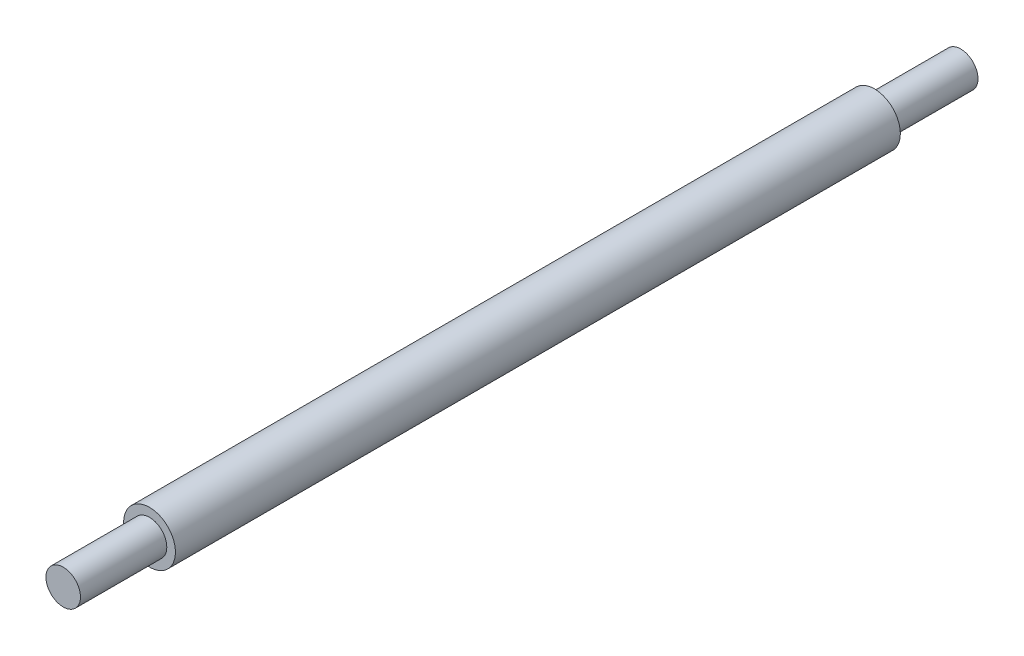
ISO-10303-21;
HEADER;
FILE_DESCRIPTION(('STEP AP214'),'2;1');
FILE_NAME('part.step','',(''),(''),'','','');
FILE_SCHEMA(('AUTOMOTIVE_DESIGN { 1 0 10303 214 1 1 1 1 }'));
ENDSEC;
DATA;
#1=APPLICATION_CONTEXT('core data for automotive mechanical design processes');
#2=APPLICATION_PROTOCOL_DEFINITION('international standard','automotive_design',2000,#1);
#3=PRODUCT_CONTEXT('',#1,'mechanical');
#4=PRODUCT('Part','Part','',(#3));
#5=PRODUCT_RELATED_PRODUCT_CATEGORY('part','',(#4));
#6=PRODUCT_DEFINITION_FORMATION('','',#4);
#7=PRODUCT_DEFINITION_CONTEXT('part definition',#1,'design');
#8=PRODUCT_DEFINITION('design','',#6,#7);
#9=PRODUCT_DEFINITION_SHAPE('','',#8);
#10=(LENGTH_UNIT() NAMED_UNIT(*) SI_UNIT(.MILLI.,.METRE.));
#11=(NAMED_UNIT(*) PLANE_ANGLE_UNIT() SI_UNIT($,.RADIAN.));
#12=(NAMED_UNIT(*) SI_UNIT($,.STERADIAN.) SOLID_ANGLE_UNIT());
#13=UNCERTAINTY_MEASURE_WITH_UNIT(LENGTH_MEASURE(1.E-05),#10,'distance_accuracy_value','');
#14=(GEOMETRIC_REPRESENTATION_CONTEXT(3) GLOBAL_UNCERTAINTY_ASSIGNED_CONTEXT((#13)) GLOBAL_UNIT_ASSIGNED_CONTEXT((#10,
#11,#12)) REPRESENTATION_CONTEXT('',''));
#15=CARTESIAN_POINT('',(0.,0.,0.));
#16=DIRECTION('',(0.,0.,1.));
#17=DIRECTION('',(1.,0.,0.));
#18=AXIS2_PLACEMENT_3D('',#15,#16,#17);
#19=CARTESIAN_POINT('',(-1.66533453693773E-13,2.22044604925031E-13,68.117647058823));
#20=DIRECTION('',(0.,0.,1.));
#21=DIRECTION('',(0.999999999999999,0.,0.));
#22=AXIS2_PLACEMENT_3D('',#19,#20,#21);
#23=CYLINDRICAL_SURFACE('',#22,2.);
#24=CARTESIAN_POINT('',(-3.33066907387547E-13,6.66133814775094E-13,51.9999999999996));
#25=DIRECTION('',(0.,0.,1.));
#26=DIRECTION('',(0.999999999999999,0.,0.));
#27=AXIS2_PLACEMENT_3D('',#24,#25,#26);
#28=CIRCLE('',#27,2.);
#29=CARTESIAN_POINT('',(1.99999999999966,6.64746035994312E-13,51.9999999999996));
#30=VERTEX_POINT('',#29);
#31=EDGE_CURVE('E10',#30,#30,#28,.T.);
#32=ORIENTED_EDGE('',*,*,#31,.F.);
#33=EDGE_LOOP('',(#32));
#34=FACE_BOUND('',#33,.T.);
#35=CARTESIAN_POINT('',(-2.77555756156289E-13,4.44089209850063E-13,41.9999999999994));
#36=DIRECTION('',(0.,0.,1.));
#37=DIRECTION('',(0.999999999999999,0.,0.));
#38=AXIS2_PLACEMENT_3D('',#35,#36,#37);
#39=CIRCLE('',#38,2.);
#40=CARTESIAN_POINT('',(1.99999999999972,4.42701431069281E-13,41.9999999999994));
#41=VERTEX_POINT('',#40);
#42=EDGE_CURVE('E67',#41,#41,#39,.T.);
#43=ORIENTED_EDGE('',*,*,#42,.T.);
#44=EDGE_LOOP('',(#43));
#45=FACE_BOUND('',#44,.T.);
#46=ADVANCED_FACE('F40',(#34,#45),#23,.T.);
#47=CARTESIAN_POINT('',(-1.11022302462516E-13,2.00000000000022,51.9999999999998));
#48=DIRECTION('',(0.,0.,-1.));
#49=DIRECTION('',(-0.999999999999999,0.,0.));
#50=AXIS2_PLACEMENT_3D('',#47,#48,#49);
#51=PLANE('',#50);
#52=ORIENTED_EDGE('',*,*,#31,.T.);
#53=EDGE_LOOP('',(#52));
#54=FACE_BOUND('',#53,.T.);
#55=ADVANCED_FACE('F98',(#54),#51,.F.);
#56=CARTESIAN_POINT('',(-3.33066907387547E-13,2.00000000000022,-52.0000000000005));
#57=DIRECTION('',(0.,0.,1.));
#58=DIRECTION('',(0.999999999999999,0.,0.));
#59=AXIS2_PLACEMENT_3D('',#56,#57,#58);
#60=PLANE('',#59);
#61=CARTESIAN_POINT('',(-4.9960036108132E-13,1.33226762955019E-12,-51.9999999999998));
#62=DIRECTION('',(0.,0.,1.));
#63=DIRECTION('',(0.999999999999999,0.,0.));
#64=AXIS2_PLACEMENT_3D('',#61,#62,#63);
#65=CIRCLE('',#64,2.00000000000001);
#66=CARTESIAN_POINT('',(1.99999999999951,1.33087985076941E-12,-51.9999999999998));
#67=VERTEX_POINT('',#66);
#68=EDGE_CURVE('E42',#67,#67,#65,.T.);
#69=ORIENTED_EDGE('',*,*,#68,.F.);
#70=EDGE_LOOP('',(#69));
#71=FACE_BOUND('',#70,.T.);
#72=ADVANCED_FACE('F93',(#71),#60,.F.);
#73=CARTESIAN_POINT('',(-1.66533453693773E-13,2.22044604925031E-13,68.117647058823));
#74=DIRECTION('',(0.,0.,1.));
#75=DIRECTION('',(0.999999999999999,0.,0.));
#76=AXIS2_PLACEMENT_3D('',#73,#74,#75);
#77=CYLINDRICAL_SURFACE('',#76,2.00000000000001);
#78=CARTESIAN_POINT('',(-6.10622663543836E-13,1.33226762955019E-12,-41.9999999999996));
#79=DIRECTION('',(0.,0.,1.));
#80=DIRECTION('',(0.999999999999999,0.,0.));
#81=AXIS2_PLACEMENT_3D('',#78,#79,#80);
#82=CIRCLE('',#81,2.00000000000001);
#83=CARTESIAN_POINT('',(1.9999999999994,1.33087985076941E-12,-41.9999999999996));
#84=VERTEX_POINT('',#83);
#85=EDGE_CURVE('E49',#84,#84,#82,.T.);
#86=ORIENTED_EDGE('',*,*,#85,.F.);
#87=EDGE_LOOP('',(#86));
#88=FACE_BOUND('',#87,.T.);
#89=ORIENTED_EDGE('',*,*,#68,.T.);
#90=EDGE_LOOP('',(#89));
#91=FACE_BOUND('',#90,.T.);
#92=ADVANCED_FACE('F88',(#88,#91),#77,.T.);
#93=CARTESIAN_POINT('',(0.,3.00000000000011,-41.9999999999998));
#94=DIRECTION('',(0.,0.,1.));
#95=DIRECTION('',(0.999999999999999,0.,0.));
#96=AXIS2_PLACEMENT_3D('',#93,#94,#95);
#97=PLANE('',#96);
#98=CARTESIAN_POINT('',(-6.10622663543836E-13,1.33226762955019E-12,-41.9999999999996));
#99=DIRECTION('',(0.,0.,1.));
#100=DIRECTION('',(0.999999999999999,0.,0.));
#101=AXIS2_PLACEMENT_3D('',#98,#99,#100);
#102=CIRCLE('',#101,3.00000000000001);
#103=CARTESIAN_POINT('',(2.9999999999994,1.33018596137902E-12,-41.9999999999996));
#104=VERTEX_POINT('',#103);
#105=EDGE_CURVE('E57',#104,#104,#102,.T.);
#106=ORIENTED_EDGE('',*,*,#105,.F.);
#107=EDGE_LOOP('',(#106));
#108=FACE_BOUND('',#107,.T.);
#109=ORIENTED_EDGE('',*,*,#85,.T.);
#110=EDGE_LOOP('',(#109));
#111=FACE_BOUND('',#110,.T.);
#112=ADVANCED_FACE('F85',(#108,#111),#97,.F.);
#113=CARTESIAN_POINT('',(-1.66533453693773E-13,2.22044604925031E-13,68.117647058823));
#114=DIRECTION('',(0.,0.,1.));
#115=DIRECTION('',(0.999999999999999,0.,0.));
#116=AXIS2_PLACEMENT_3D('',#113,#114,#115);
#117=CYLINDRICAL_SURFACE('',#116,3.00000000000001);
#118=CARTESIAN_POINT('',(-2.77555756156289E-13,4.44089209850063E-13,41.9999999999994));
#119=DIRECTION('',(0.,0.,1.));
#120=DIRECTION('',(0.999999999999999,0.,0.));
#121=AXIS2_PLACEMENT_3D('',#118,#119,#120);
#122=CIRCLE('',#121,3.);
#123=CARTESIAN_POINT('',(2.99999999999972,4.4200754167889E-13,41.9999999999994));
#124=VERTEX_POINT('',#123);
#125=EDGE_CURVE('E62',#124,#124,#122,.T.);
#126=ORIENTED_EDGE('',*,*,#125,.F.);
#127=EDGE_LOOP('',(#126));
#128=FACE_BOUND('',#127,.T.);
#129=ORIENTED_EDGE('',*,*,#105,.T.);
#130=EDGE_LOOP('',(#129));
#131=FACE_BOUND('',#130,.T.);
#132=ADVANCED_FACE('F78',(#128,#131),#117,.T.);
#133=CARTESIAN_POINT('',(-3.88578058618805E-13,3.00000000000056,41.9999999999996));
#134=DIRECTION('',(0.,0.,-1.));
#135=DIRECTION('',(-0.999999999999999,0.,0.));
#136=AXIS2_PLACEMENT_3D('',#133,#134,#135);
#137=PLANE('',#136);
#138=ORIENTED_EDGE('',*,*,#42,.F.);
#139=EDGE_LOOP('',(#138));
#140=FACE_BOUND('',#139,.T.);
#141=ORIENTED_EDGE('',*,*,#125,.T.);
#142=EDGE_LOOP('',(#141));
#143=FACE_BOUND('',#142,.T.);
#144=ADVANCED_FACE('F74',(#140,#143),#137,.F.);
#145=CLOSED_SHELL('',(#46,#55,#72,#92,#112,#132,#144));
#146=MANIFOLD_SOLID_BREP('B2',#145);
#147=ADVANCED_BREP_SHAPE_REPRESENTATION('',(#18,#146),#14);
#148=SHAPE_DEFINITION_REPRESENTATION(#9,#147);
ENDSEC;
END-ISO-10303-21;
